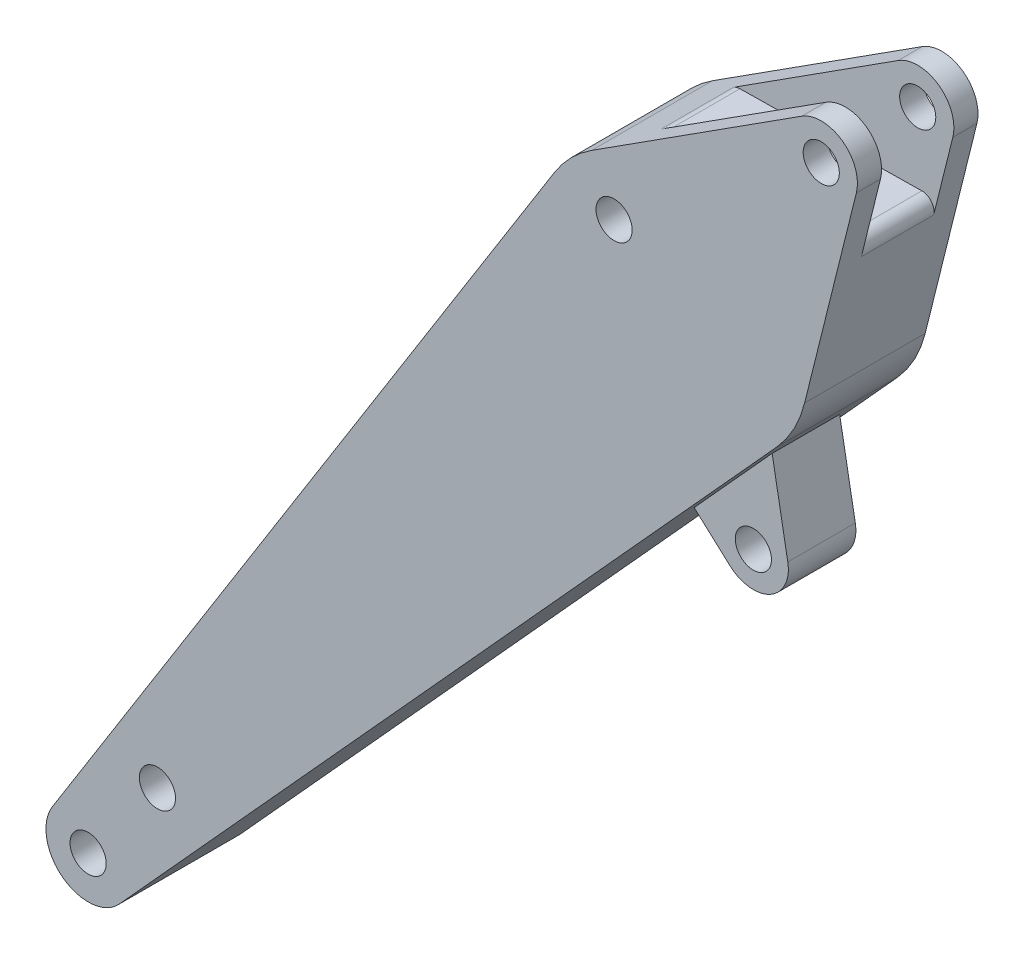
ISO-10303-21;
HEADER;
FILE_DESCRIPTION(('STEP AP214'),'2;1');
FILE_NAME('part.step','',(''),(''),'','','');
FILE_SCHEMA(('AUTOMOTIVE_DESIGN { 1 0 10303 214 1 1 1 1 }'));
ENDSEC;
DATA;
#1=APPLICATION_CONTEXT('core data for automotive mechanical design processes');
#2=APPLICATION_PROTOCOL_DEFINITION('international standard','automotive_design',2000,#1);
#3=PRODUCT_CONTEXT('',#1,'mechanical');
#4=PRODUCT('Part','Part','',(#3));
#5=PRODUCT_RELATED_PRODUCT_CATEGORY('part','',(#4));
#6=PRODUCT_DEFINITION_FORMATION('','',#4);
#7=PRODUCT_DEFINITION_CONTEXT('part definition',#1,'design');
#8=PRODUCT_DEFINITION('design','',#6,#7);
#9=PRODUCT_DEFINITION_SHAPE('','',#8);
#10=(LENGTH_UNIT() NAMED_UNIT(*) SI_UNIT(.MILLI.,.METRE.));
#11=(NAMED_UNIT(*) PLANE_ANGLE_UNIT() SI_UNIT($,.RADIAN.));
#12=(NAMED_UNIT(*) SI_UNIT($,.STERADIAN.) SOLID_ANGLE_UNIT());
#13=UNCERTAINTY_MEASURE_WITH_UNIT(LENGTH_MEASURE(1.E-05),#10,'distance_accuracy_value','');
#14=(GEOMETRIC_REPRESENTATION_CONTEXT(3) GLOBAL_UNCERTAINTY_ASSIGNED_CONTEXT((#13)) GLOBAL_UNIT_ASSIGNED_CONTEXT((#10,
#11,#12)) REPRESENTATION_CONTEXT('',''));
#15=CARTESIAN_POINT('',(0.,0.,0.));
#16=DIRECTION('',(0.,0.,1.));
#17=DIRECTION('',(1.,0.,0.));
#18=AXIS2_PLACEMENT_3D('',#15,#16,#17);
#19=CARTESIAN_POINT('',(268.272359212671,105.010587180975,-7.5));
#20=DIRECTION('',(0.740552858374982,-0.671998113057354,0.));
#21=DIRECTION('',(0.671998113057354,0.740552858374982,0.));
#22=AXIS2_PLACEMENT_3D('',#19,#20,#21);
#23=PLANE('',#22);
#24=DIRECTION('',(0.671998113057354,0.740552858374982,0.));
#25=VECTOR('',#24,1.);
#26=CARTESIAN_POINT('',(268.272359212671,105.010587180975,-7.5));
#27=LINE('',#26,#25);
#28=CARTESIAN_POINT('',(183.939116284921,12.0739808234994,-7.5));
#29=VERTEX_POINT('',#28);
#30=CARTESIAN_POINT('',(265.736612477699,102.216153005922,-7.5));
#31=VERTEX_POINT('',#30);
#32=EDGE_CURVE('E285',#29,#31,#27,.T.);
#33=ORIENTED_EDGE('',*,*,#32,.T.);
#34=DIRECTION('',(0.,0.,1.));
#35=VECTOR('',#34,1.);
#36=CARTESIAN_POINT('',(265.736612477699,102.216153005922,-7.5));
#37=LINE('',#36,#35);
#38=CARTESIAN_POINT('',(265.736612477699,102.216153005922,7.5));
#39=VERTEX_POINT('',#38);
#40=EDGE_CURVE('E299',#31,#39,#37,.T.);
#41=ORIENTED_EDGE('',*,*,#40,.T.);
#42=DIRECTION('',(0.671998113057354,0.740552858374982,0.));
#43=VECTOR('',#42,1.);
#44=CARTESIAN_POINT('',(268.272359212671,105.010587180975,7.5));
#45=LINE('',#44,#43);
#46=CARTESIAN_POINT('',(183.939116284921,12.0739808234994,7.5));
#47=VERTEX_POINT('',#46);
#48=EDGE_CURVE('E251',#47,#39,#45,.T.);
#49=ORIENTED_EDGE('',*,*,#48,.F.);
#50=DIRECTION('',(0.,0.,1.));
#51=VECTOR('',#50,1.);
#52=CARTESIAN_POINT('',(183.939116284921,12.0739808234994,-7.5));
#53=LINE('',#52,#51);
#54=EDGE_CURVE('E294',#29,#47,#53,.T.);
#55=ORIENTED_EDGE('',*,*,#54,.F.);
#56=EDGE_LOOP('',(#33,#41,#49,#55));
#57=FACE_BOUND('',#56,.T.);
#58=DIRECTION('',(0.,0.,1.));
#59=VECTOR('',#58,1.);
#60=CARTESIAN_POINT('',(261.843936235976,97.9263604283488,-4.2));
#61=LINE('',#60,#59);
#62=CARTESIAN_POINT('',(261.843936235976,97.9263604283488,-4.2));
#63=VERTEX_POINT('',#62);
#64=CARTESIAN_POINT('',(261.843936235976,97.9263604283488,4.2));
#65=VERTEX_POINT('',#64);
#66=EDGE_CURVE('E208',#63,#65,#61,.T.);
#67=ORIENTED_EDGE('',*,*,#66,.F.);
#68=DIRECTION('',(-0.671998113057354,-0.740552858374982,0.));
#69=VECTOR('',#68,1.);
#70=CARTESIAN_POINT('',(252.141372419818,87.2339771790396,-4.2));
#71=LINE('',#70,#69);
#72=CARTESIAN_POINT('',(252.141372419818,87.2339771790396,-4.2));
#73=VERTEX_POINT('',#72);
#74=EDGE_CURVE('E175',#63,#73,#71,.T.);
#75=ORIENTED_EDGE('',*,*,#74,.T.);
#76=DIRECTION('',(0.,0.,1.));
#77=VECTOR('',#76,1.);
#78=CARTESIAN_POINT('',(252.141372419818,87.2339771790396,-4.2));
#79=LINE('',#78,#77);
#80=CARTESIAN_POINT('',(252.141372419818,87.2339771790396,4.2));
#81=VERTEX_POINT('',#80);
#82=EDGE_CURVE('E168',#73,#81,#79,.T.);
#83=ORIENTED_EDGE('',*,*,#82,.T.);
#84=DIRECTION('',(-0.671998113057354,-0.740552858374982,0.));
#85=VECTOR('',#84,1.);
#86=CARTESIAN_POINT('',(252.141372419818,87.2339771790396,4.2));
#87=LINE('',#86,#85);
#88=EDGE_CURVE('E169',#65,#81,#87,.T.);
#89=ORIENTED_EDGE('',*,*,#88,.F.);
#90=EDGE_LOOP('',(#67,#75,#83,#89));
#91=FACE_BOUND('',#90,.T.);
#92=ADVANCED_FACE('F45',(#57,#91),#23,.T.);
#93=CARTESIAN_POINT('',(271.251213778452,135.60197091705,-7.5));
#94=DIRECTION('',(0.,0.,1.));
#95=DIRECTION('',(1.,0.,0.));
#96=AXIS2_PLACEMENT_3D('',#93,#94,#95);
#97=CYLINDRICAL_SURFACE('',#96,4.49999999999998);
#98=DIRECTION('',(0.,0.,1.));
#99=VECTOR('',#98,1.);
#100=CARTESIAN_POINT('',(268.822977766155,139.390594660389,-7.5));
#101=LINE('',#100,#99);
#102=CARTESIAN_POINT('',(268.822977766155,139.390594660389,-7.5));
#103=VERTEX_POINT('',#102);
#104=CARTESIAN_POINT('',(268.822977766155,139.390594660388,-4.5));
#105=VERTEX_POINT('',#104);
#106=EDGE_CURVE('E297',#103,#105,#101,.T.);
#107=ORIENTED_EDGE('',*,*,#106,.T.);
#108=CARTESIAN_POINT('',(271.251213778452,135.60197091705,-4.5));
#109=DIRECTION('',(0.,0.,1.));
#110=DIRECTION('',(1.,0.,0.));
#111=AXIS2_PLACEMENT_3D('',#108,#109,#110);
#112=CIRCLE('',#111,4.49999999999998);
#113=CARTESIAN_POINT('',(275.617915088876,134.51480962932,-4.5));
#114=VERTEX_POINT('',#113);
#115=EDGE_CURVE('E219',#114,#105,#112,.T.);
#116=ORIENTED_EDGE('',*,*,#115,.F.);
#117=DIRECTION('',(0.,0.,1.));
#118=VECTOR('',#117,1.);
#119=CARTESIAN_POINT('',(275.617915088876,134.51480962932,-7.5));
#120=LINE('',#119,#118);
#121=CARTESIAN_POINT('',(275.617915088876,134.51480962932,-7.5));
#122=VERTEX_POINT('',#121);
#123=EDGE_CURVE('E302',#122,#114,#120,.T.);
#124=ORIENTED_EDGE('',*,*,#123,.F.);
#125=CARTESIAN_POINT('',(271.251213778452,135.60197091705,-7.5));
#126=DIRECTION('',(0.,0.,1.));
#127=DIRECTION('',(-1.,0.,0.));
#128=AXIS2_PLACEMENT_3D('',#125,#126,#127);
#129=CIRCLE('',#128,4.49999999999998);
#130=EDGE_CURVE('E286',#122,#103,#129,.T.);
#131=ORIENTED_EDGE('',*,*,#130,.T.);
#132=EDGE_LOOP('',(#107,#116,#124,#131));
#133=FACE_BOUND('',#132,.T.);
#134=ADVANCED_FACE('F359',(#133),#97,.T.);
#135=CARTESIAN_POINT('',(271.251213778452,135.60197091705,-7.5));
#136=DIRECTION('',(0.,0.,1.));
#137=DIRECTION('',(1.,0.,0.));
#138=AXIS2_PLACEMENT_3D('',#135,#136,#137);
#139=CYLINDRICAL_SURFACE('',#138,2.25000000000004);
#140=CARTESIAN_POINT('',(271.251213778452,135.60197091705,-7.5));
#141=DIRECTION('',(0.,0.,1.));
#142=DIRECTION('',(1.,0.,0.));
#143=AXIS2_PLACEMENT_3D('',#140,#141,#142);
#144=CIRCLE('',#143,2.25000000000004);
#145=CARTESIAN_POINT('',(273.501213778452,135.60197091705,-7.5));
#146=VERTEX_POINT('',#145);
#147=EDGE_CURVE('E267',#146,#146,#144,.T.);
#148=ORIENTED_EDGE('',*,*,#147,.F.);
#149=EDGE_LOOP('',(#148));
#150=FACE_BOUND('',#149,.T.);
#151=CARTESIAN_POINT('',(271.251213778452,135.60197091705,-4.5));
#152=DIRECTION('',(0.,0.,1.));
#153=DIRECTION('',(1.,0.,0.));
#154=AXIS2_PLACEMENT_3D('',#151,#152,#153);
#155=CIRCLE('',#154,2.25000000000004);
#156=CARTESIAN_POINT('',(273.501213778452,135.60197091705,-4.5));
#157=VERTEX_POINT('',#156);
#158=EDGE_CURVE('E211',#157,#157,#155,.T.);
#159=ORIENTED_EDGE('',*,*,#158,.T.);
#160=EDGE_LOOP('',(#159));
#161=FACE_BOUND('',#160,.T.);
#162=ADVANCED_FACE('F408',(#150,#161),#139,.F.);
#163=CARTESIAN_POINT('',(180.051213778452,15.6019709170505,-7.5));
#164=DIRECTION('',(0.,0.,1.));
#165=DIRECTION('',(1.,0.,0.));
#166=AXIS2_PLACEMENT_3D('',#163,#164,#165);
#167=CYLINDRICAL_SURFACE('',#166,5.25000000000002);
#168=ORIENTED_EDGE('',*,*,#54,.T.);
#169=CARTESIAN_POINT('',(180.051213778452,15.6019709170505,7.5));
#170=DIRECTION('',(0.,0.,1.));
#171=DIRECTION('',(1.,0.,0.));
#172=AXIS2_PLACEMENT_3D('',#169,#170,#171);
#173=CIRCLE('',#172,5.25000000000002);
#174=CARTESIAN_POINT('',(175.603869390468,18.3918863090769,7.5));
#175=VERTEX_POINT('',#174);
#176=EDGE_CURVE('E252',#175,#47,#173,.T.);
#177=ORIENTED_EDGE('',*,*,#176,.F.);
#178=DIRECTION('',(0.,0.,1.));
#179=VECTOR('',#178,1.);
#180=CARTESIAN_POINT('',(175.603869390468,18.3918863090769,-7.5));
#181=LINE('',#180,#179);
#182=CARTESIAN_POINT('',(175.603869390468,18.3918863090769,-7.5));
#183=VERTEX_POINT('',#182);
#184=EDGE_CURVE('E298',#183,#175,#181,.T.);
#185=ORIENTED_EDGE('',*,*,#184,.F.);
#186=CARTESIAN_POINT('',(180.051213778452,15.6019709170505,-7.5));
#187=DIRECTION('',(0.,0.,1.));
#188=DIRECTION('',(1.,0.,0.));
#189=AXIS2_PLACEMENT_3D('',#186,#187,#188);
#190=CIRCLE('',#189,5.25000000000002);
#191=EDGE_CURVE('E278',#183,#29,#190,.T.);
#192=ORIENTED_EDGE('',*,*,#191,.T.);
#193=EDGE_LOOP('',(#168,#177,#185,#192));
#194=FACE_BOUND('',#193,.T.);
#195=ADVANCED_FACE('F384',(#194),#167,.T.);
#196=CARTESIAN_POINT('',(239.866500086119,120.831569891679,-7.5));
#197=DIRECTION('',(-0.847113216758896,0.531412455624063,0.));
#198=DIRECTION('',(-0.531412455624063,-0.847113216758896,0.));
#199=AXIS2_PLACEMENT_3D('',#196,#197,#198);
#200=PLANE('',#199);
#201=DIRECTION('',(-0.531412455624063,-0.847113216758896,0.));
#202=VECTOR('',#201,1.);
#203=CARTESIAN_POINT('',(239.866500086119,120.831569891679,7.5));
#204=LINE('',#203,#202);
#205=CARTESIAN_POINT('',(238.081653342399,117.98638391515,7.5));
#206=VERTEX_POINT('',#205);
#207=EDGE_CURVE('E264',#206,#175,#204,.T.);
#208=ORIENTED_EDGE('',*,*,#207,.F.);
#209=DIRECTION('',(0.,0.,1.));
#210=VECTOR('',#209,1.);
#211=CARTESIAN_POINT('',(238.081653342399,117.98638391515,-7.5));
#212=LINE('',#211,#210);
#213=CARTESIAN_POINT('',(238.081653342399,117.98638391515,-7.5));
#214=VERTEX_POINT('',#213);
#215=EDGE_CURVE('E323',#206,#214,#212,.F.);
#216=ORIENTED_EDGE('',*,*,#215,.T.);
#217=DIRECTION('',(-0.531412455624063,-0.847113216758896,0.));
#218=VECTOR('',#217,1.);
#219=CARTESIAN_POINT('',(239.866500086119,120.831569891679,-7.5));
#220=LINE('',#219,#218);
#221=EDGE_CURVE('E291',#214,#183,#220,.T.);
#222=ORIENTED_EDGE('',*,*,#221,.T.);
#223=ORIENTED_EDGE('',*,*,#184,.T.);
#224=EDGE_LOOP('',(#208,#216,#222,#223));
#225=FACE_BOUND('',#224,.T.);
#226=ADVANCED_FACE('F409',(#225),#200,.T.);
#227=CARTESIAN_POINT('',(268.822977766155,139.390594660389,-7.5));
#228=DIRECTION('',(-0.539608002732634,0.841916387408452,0.));
#229=DIRECTION('',(-0.841916387408452,-0.539608002732634,0.));
#230=AXIS2_PLACEMENT_3D('',#227,#228,#229);
#231=PLANE('',#230);
#232=DIRECTION('',(0.,0.,-1.));
#233=VECTOR('',#232,1.);
#234=CARTESIAN_POINT('',(248.346136663052,126.266408583038,-7.5));
#235=LINE('',#234,#233);
#236=CARTESIAN_POINT('',(248.346136663051,126.266408583038,4.5));
#237=VERTEX_POINT('',#236);
#238=CARTESIAN_POINT('',(248.346136663052,126.266408583038,-4.5));
#239=VERTEX_POINT('',#238);
#240=EDGE_CURVE('E333',#237,#239,#235,.T.);
#241=ORIENTED_EDGE('',*,*,#240,.T.);
#242=DIRECTION('',(-0.841916387408452,-0.539608002732634,0.));
#243=VECTOR('',#242,1.);
#244=CARTESIAN_POINT('',(-84.4778335396928,-87.0498785312536,-4.5));
#245=LINE('',#244,#243);
#246=EDGE_CURVE('E60',#105,#239,#245,.T.);
#247=ORIENTED_EDGE('',*,*,#246,.F.);
#248=ORIENTED_EDGE('',*,*,#106,.F.);
#249=DIRECTION('',(-0.841916387408452,-0.539608002732634,0.));
#250=VECTOR('',#249,1.);
#251=CARTESIAN_POINT('',(268.822977766155,139.390594660389,-7.5));
#252=LINE('',#251,#250);
#253=CARTESIAN_POINT('',(242.694231552793,122.643942891916,-7.5));
#254=VERTEX_POINT('',#253);
#255=EDGE_CURVE('E287',#103,#254,#252,.T.);
#256=ORIENTED_EDGE('',*,*,#255,.T.);
#257=DIRECTION('',(0.,0.,1.));
#258=VECTOR('',#257,1.);
#259=CARTESIAN_POINT('',(242.694231552793,122.643942891916,-7.5));
#260=LINE('',#259,#258);
#261=CARTESIAN_POINT('',(242.694231552793,122.643942891916,7.5));
#262=VERTEX_POINT('',#261);
#263=EDGE_CURVE('E324',#254,#262,#260,.T.);
#264=ORIENTED_EDGE('',*,*,#263,.T.);
#265=DIRECTION('',(-0.841916387408452,-0.539608002732634,0.));
#266=VECTOR('',#265,1.);
#267=CARTESIAN_POINT('',(268.822977766155,139.390594660389,7.5));
#268=LINE('',#267,#266);
#269=CARTESIAN_POINT('',(268.822977766155,139.390594660389,7.5));
#270=VERTEX_POINT('',#269);
#271=EDGE_CURVE('E265',#270,#262,#268,.T.);
#272=ORIENTED_EDGE('',*,*,#271,.F.);
#273=CARTESIAN_POINT('',(268.822977766155,139.390594660388,4.5));
#274=VERTEX_POINT('',#273);
#275=EDGE_CURVE('E303',#274,#270,#101,.T.);
#276=ORIENTED_EDGE('',*,*,#275,.F.);
#277=DIRECTION('',(-0.841916387408452,-0.539608002732634,0.));
#278=VECTOR('',#277,1.);
#279=CARTESIAN_POINT('',(-84.4778335396928,-87.0498785312536,4.5));
#280=LINE('',#279,#278);
#281=EDGE_CURVE('E62',#274,#237,#280,.T.);
#282=ORIENTED_EDGE('',*,*,#281,.T.);
#283=EDGE_LOOP('',(#241,#247,#248,#256,#264,#272,#276,#282));
#284=FACE_BOUND('',#283,.T.);
#285=ADVANCED_FACE('F393',(#284),#231,.T.);
#286=CARTESIAN_POINT('',(271.251213778452,135.60197091705,4.5));
#287=DIRECTION('',(0.,0.,1.));
#288=DIRECTION('',(1.,0.,0.));
#289=AXIS2_PLACEMENT_3D('',#286,#287,#288);
#290=CIRCLE('',#289,4.49999999999998);
#291=CARTESIAN_POINT('',(275.617915088876,134.51480962932,4.5));
#292=VERTEX_POINT('',#291);
#293=EDGE_CURVE('E235',#292,#274,#290,.T.);
#294=ORIENTED_EDGE('',*,*,#293,.T.);
#295=ORIENTED_EDGE('',*,*,#275,.T.);
#296=CARTESIAN_POINT('',(271.251213778452,135.60197091705,7.5));
#297=DIRECTION('',(0.,0.,1.));
#298=DIRECTION('',(-1.,0.,0.));
#299=AXIS2_PLACEMENT_3D('',#296,#297,#298);
#300=CIRCLE('',#299,4.49999999999998);
#301=CARTESIAN_POINT('',(275.617915088876,134.51480962932,7.5));
#302=VERTEX_POINT('',#301);
#303=EDGE_CURVE('E258',#302,#270,#300,.T.);
#304=ORIENTED_EDGE('',*,*,#303,.F.);
#305=EDGE_CURVE('E310',#292,#302,#120,.T.);
#306=ORIENTED_EDGE('',*,*,#305,.F.);
#307=EDGE_LOOP('',(#294,#295,#304,#306));
#308=FACE_BOUND('',#307,.T.);
#309=ADVANCED_FACE('F400',(#308),#97,.T.);
#310=CARTESIAN_POINT('',(268.272359212671,105.010587180975,-7.5));
#311=DIRECTION('',(0.97037806898317,-0.241591397273358,0.));
#312=DIRECTION('',(0.241591397273358,0.97037806898317,0.));
#313=AXIS2_PLACEMENT_3D('',#310,#311,#312);
#314=PLANE('',#313);
#315=DIRECTION('',(0.241591397273358,0.97037806898317,0.));
#316=VECTOR('',#315,1.);
#317=CARTESIAN_POINT('',(211.94806038838,-121.222072370656,-4.5));
#318=LINE('',#317,#316);
#319=CARTESIAN_POINT('',(273.237810212675,124.954860062356,-4.5));
#320=VERTEX_POINT('',#319);
#321=EDGE_CURVE('E218',#320,#114,#318,.T.);
#322=ORIENTED_EDGE('',*,*,#321,.F.);
#323=DIRECTION('',(0.,0.,-1.));
#324=VECTOR('',#323,1.);
#325=CARTESIAN_POINT('',(273.237810212675,124.954860062356,-7.5));
#326=LINE('',#325,#324);
#327=CARTESIAN_POINT('',(273.237810212675,124.954860062356,4.5));
#328=VERTEX_POINT('',#327);
#329=EDGE_CURVE('E334',#320,#328,#326,.F.);
#330=ORIENTED_EDGE('',*,*,#329,.T.);
#331=DIRECTION('',(0.241591397273358,0.97037806898317,0.));
#332=VECTOR('',#331,1.);
#333=CARTESIAN_POINT('',(211.94806038838,-121.222072370656,4.5));
#334=LINE('',#333,#332);
#335=EDGE_CURVE('E230',#328,#292,#334,.T.);
#336=ORIENTED_EDGE('',*,*,#335,.T.);
#337=ORIENTED_EDGE('',*,*,#305,.T.);
#338=DIRECTION('',(0.241591397273358,0.97037806898317,0.));
#339=VECTOR('',#338,1.);
#340=CARTESIAN_POINT('',(268.272359212671,105.010587180975,7.5));
#341=LINE('',#340,#339);
#342=CARTESIAN_POINT('',(269.183990636822,108.672253742682,7.5));
#343=VERTEX_POINT('',#342);
#344=EDGE_CURVE('E256',#343,#302,#341,.T.);
#345=ORIENTED_EDGE('',*,*,#344,.F.);
#346=DIRECTION('',(0.,0.,1.));
#347=VECTOR('',#346,1.);
#348=CARTESIAN_POINT('',(269.183990636822,108.672253742682,-7.5));
#349=LINE('',#348,#347);
#350=CARTESIAN_POINT('',(269.183990636822,108.672253742682,-7.5));
#351=VERTEX_POINT('',#350);
#352=EDGE_CURVE('E314',#343,#351,#349,.F.);
#353=ORIENTED_EDGE('',*,*,#352,.T.);
#354=DIRECTION('',(0.241591397273358,0.97037806898317,0.));
#355=VECTOR('',#354,1.);
#356=CARTESIAN_POINT('',(268.272359212671,105.010587180975,-7.5));
#357=LINE('',#356,#355);
#358=EDGE_CURVE('E284',#351,#122,#357,.T.);
#359=ORIENTED_EDGE('',*,*,#358,.T.);
#360=ORIENTED_EDGE('',*,*,#123,.T.);
#361=EDGE_LOOP('',(#322,#330,#336,#337,#345,#353,#359,#360));
#362=FACE_BOUND('',#361,.T.);
#363=ADVANCED_FACE('F365',(#362),#314,.T.);
#364=CARTESIAN_POINT('',(180.051213778452,15.6019709170505,-7.5));
#365=DIRECTION('',(0.,0.,1.));
#366=DIRECTION('',(1.,0.,0.));
#367=AXIS2_PLACEMENT_3D('',#364,#365,#366);
#368=PLANE('',#367);
#369=CARTESIAN_POINT('',(245.479443554687,116.565732855567,-7.5));
#370=DIRECTION('',(0.,0.,1.));
#371=DIRECTION('',(1.,0.,0.));
#372=AXIS2_PLACEMENT_3D('',#369,#370,#371);
#373=CIRCLE('',#372,2.24999999999998);
#374=CARTESIAN_POINT('',(247.729443554687,116.565732855567,-7.5));
#375=VERTEX_POINT('',#374);
#376=EDGE_CURVE('E266',#375,#375,#373,.T.);
#377=ORIENTED_EDGE('',*,*,#376,.T.);
#378=EDGE_LOOP('',(#377));
#379=FACE_BOUND('',#378,.T.);
#380=ORIENTED_EDGE('',*,*,#147,.T.);
#381=EDGE_LOOP('',(#380));
#382=FACE_BOUND('',#381,.T.);
#383=CARTESIAN_POINT('',(188.673650340805,26.9472821833047,-7.5));
#384=DIRECTION('',(0.,0.,1.));
#385=DIRECTION('',(1.,0.,0.));
#386=AXIS2_PLACEMENT_3D('',#383,#384,#385);
#387=CIRCLE('',#386,2.25);
#388=CARTESIAN_POINT('',(190.923650340805,26.9472821833047,-7.5));
#389=VERTEX_POINT('',#388);
#390=EDGE_CURVE('E271',#389,#389,#387,.T.);
#391=ORIENTED_EDGE('',*,*,#390,.T.);
#392=EDGE_LOOP('',(#391));
#393=FACE_BOUND('',#392,.T.);
#394=CARTESIAN_POINT('',(180.051213778452,15.6019709170505,-7.5));
#395=DIRECTION('',(0.,0.,1.));
#396=DIRECTION('',(1.,0.,0.));
#397=AXIS2_PLACEMENT_3D('',#394,#395,#396);
#398=CIRCLE('',#397,2.25);
#399=CARTESIAN_POINT('',(182.301213778452,15.6019709170505,-7.5));
#400=VERTEX_POINT('',#399);
#401=EDGE_CURVE('E279',#400,#400,#398,.T.);
#402=ORIENTED_EDGE('',*,*,#401,.T.);
#403=EDGE_LOOP('',(#402));
#404=FACE_BOUND('',#403,.T.);
#405=ORIENTED_EDGE('',*,*,#358,.F.);
#406=CARTESIAN_POINT('',(254.628319602075,112.296124701782,-7.5));
#407=DIRECTION('',(0.,0.,1.));
#408=DIRECTION('',(1.,0.,0.));
#409=AXIS2_PLACEMENT_3D('',#406,#407,#408);
#410=CIRCLE('',#409,15.);
#411=EDGE_CURVE('E316',#351,#31,#410,.F.);
#412=ORIENTED_EDGE('',*,*,#411,.T.);
#413=ORIENTED_EDGE('',*,*,#32,.F.);
#414=ORIENTED_EDGE('',*,*,#191,.F.);
#415=ORIENTED_EDGE('',*,*,#221,.F.);
#416=CARTESIAN_POINT('',(250.788351593783,110.015197080789,-7.5));
#417=DIRECTION('',(0.,0.,1.));
#418=DIRECTION('',(1.,0.,0.));
#419=AXIS2_PLACEMENT_3D('',#416,#417,#418);
#420=CIRCLE('',#419,15.);
#421=EDGE_CURVE('E320',#214,#254,#420,.F.);
#422=ORIENTED_EDGE('',*,*,#421,.T.);
#423=ORIENTED_EDGE('',*,*,#255,.F.);
#424=ORIENTED_EDGE('',*,*,#130,.F.);
#425=EDGE_LOOP('',(#405,#412,#413,#414,#415,#422,#423,#424));
#426=FACE_BOUND('',#425,.T.);
#427=ADVANCED_FACE('F368',(#379,#382,#393,#404,#426),#368,.F.);
#428=CARTESIAN_POINT('',(180.051213778452,15.6019709170505,-7.5));
#429=DIRECTION('',(0.,0.,1.));
#430=DIRECTION('',(1.,0.,0.));
#431=AXIS2_PLACEMENT_3D('',#428,#429,#430);
#432=CYLINDRICAL_SURFACE('',#431,2.25);
#433=ORIENTED_EDGE('',*,*,#401,.F.);
#434=EDGE_LOOP('',(#433));
#435=FACE_BOUND('',#434,.T.);
#436=CARTESIAN_POINT('',(180.051213778452,15.6019709170505,7.5));
#437=DIRECTION('',(0.,0.,1.));
#438=DIRECTION('',(1.,0.,0.));
#439=AXIS2_PLACEMENT_3D('',#436,#437,#438);
#440=CIRCLE('',#439,2.25);
#441=CARTESIAN_POINT('',(182.301213778452,15.6019709170505,7.5));
#442=VERTEX_POINT('',#441);
#443=EDGE_CURVE('E247',#442,#442,#440,.T.);
#444=ORIENTED_EDGE('',*,*,#443,.T.);
#445=EDGE_LOOP('',(#444));
#446=FACE_BOUND('',#445,.T.);
#447=ADVANCED_FACE('F543',(#435,#446),#432,.F.);
#448=CARTESIAN_POINT('',(188.673650340805,26.9472821833047,-7.5));
#449=DIRECTION('',(0.,0.,1.));
#450=DIRECTION('',(1.,0.,0.));
#451=AXIS2_PLACEMENT_3D('',#448,#449,#450);
#452=CYLINDRICAL_SURFACE('',#451,2.25);
#453=ORIENTED_EDGE('',*,*,#390,.F.);
#454=EDGE_LOOP('',(#453));
#455=FACE_BOUND('',#454,.T.);
#456=CARTESIAN_POINT('',(188.673650340805,26.9472821833047,7.5));
#457=DIRECTION('',(0.,0.,1.));
#458=DIRECTION('',(1.,0.,0.));
#459=AXIS2_PLACEMENT_3D('',#456,#457,#458);
#460=CIRCLE('',#459,2.25);
#461=CARTESIAN_POINT('',(190.923650340805,26.9472821833047,7.5));
#462=VERTEX_POINT('',#461);
#463=EDGE_CURVE('E244',#462,#462,#460,.T.);
#464=ORIENTED_EDGE('',*,*,#463,.T.);
#465=EDGE_LOOP('',(#464));
#466=FACE_BOUND('',#465,.T.);
#467=ADVANCED_FACE('F539',(#455,#466),#452,.F.);
#468=CARTESIAN_POINT('',(271.251213778452,135.60197091705,4.5));
#469=DIRECTION('',(0.,0.,1.));
#470=DIRECTION('',(1.,0.,0.));
#471=AXIS2_PLACEMENT_3D('',#468,#469,#470);
#472=CIRCLE('',#471,2.25000000000004);
#473=CARTESIAN_POINT('',(273.501213778452,135.60197091705,4.5));
#474=VERTEX_POINT('',#473);
#475=EDGE_CURVE('E228',#474,#474,#472,.T.);
#476=ORIENTED_EDGE('',*,*,#475,.F.);
#477=EDGE_LOOP('',(#476));
#478=FACE_BOUND('',#477,.T.);
#479=CARTESIAN_POINT('',(271.251213778452,135.60197091705,7.5));
#480=DIRECTION('',(0.,0.,1.));
#481=DIRECTION('',(1.,0.,0.));
#482=AXIS2_PLACEMENT_3D('',#479,#480,#481);
#483=CIRCLE('',#482,2.25000000000004);
#484=CARTESIAN_POINT('',(273.501213778452,135.60197091705,7.5));
#485=VERTEX_POINT('',#484);
#486=EDGE_CURVE('E245',#485,#485,#483,.T.);
#487=ORIENTED_EDGE('',*,*,#486,.T.);
#488=EDGE_LOOP('',(#487));
#489=FACE_BOUND('',#488,.T.);
#490=ADVANCED_FACE('F519',(#478,#489),#139,.F.);
#491=CARTESIAN_POINT('',(245.479443554687,116.565732855567,-7.5));
#492=DIRECTION('',(0.,0.,1.));
#493=DIRECTION('',(1.,0.,0.));
#494=AXIS2_PLACEMENT_3D('',#491,#492,#493);
#495=CYLINDRICAL_SURFACE('',#494,2.24999999999998);
#496=ORIENTED_EDGE('',*,*,#376,.F.);
#497=EDGE_LOOP('',(#496));
#498=FACE_BOUND('',#497,.T.);
#499=CARTESIAN_POINT('',(245.479443554687,116.565732855567,7.5));
#500=DIRECTION('',(0.,0.,1.));
#501=DIRECTION('',(1.,0.,0.));
#502=AXIS2_PLACEMENT_3D('',#499,#500,#501);
#503=CIRCLE('',#502,2.24999999999998);
#504=CARTESIAN_POINT('',(247.729443554687,116.565732855567,7.5));
#505=VERTEX_POINT('',#504);
#506=EDGE_CURVE('E237',#505,#505,#503,.T.);
#507=ORIENTED_EDGE('',*,*,#506,.T.);
#508=EDGE_LOOP('',(#507));
#509=FACE_BOUND('',#508,.T.);
#510=ADVANCED_FACE('F521',(#498,#509),#495,.F.);
#511=CARTESIAN_POINT('',(180.051213778452,15.6019709170505,7.5));
#512=DIRECTION('',(0.,0.,1.));
#513=DIRECTION('',(1.,0.,0.));
#514=AXIS2_PLACEMENT_3D('',#511,#512,#513);
#515=PLANE('',#514);
#516=ORIENTED_EDGE('',*,*,#486,.F.);
#517=EDGE_LOOP('',(#516));
#518=FACE_BOUND('',#517,.T.);
#519=ORIENTED_EDGE('',*,*,#443,.F.);
#520=EDGE_LOOP('',(#519));
#521=FACE_BOUND('',#520,.T.);
#522=ORIENTED_EDGE('',*,*,#48,.T.);
#523=CARTESIAN_POINT('',(254.628319602075,112.296124701782,7.5));
#524=DIRECTION('',(0.,0.,1.));
#525=DIRECTION('',(1.,0.,0.));
#526=AXIS2_PLACEMENT_3D('',#523,#524,#525);
#527=CIRCLE('',#526,15.);
#528=EDGE_CURVE('E312',#39,#343,#527,.T.);
#529=ORIENTED_EDGE('',*,*,#528,.T.);
#530=ORIENTED_EDGE('',*,*,#344,.T.);
#531=ORIENTED_EDGE('',*,*,#303,.T.);
#532=ORIENTED_EDGE('',*,*,#271,.T.);
#533=CARTESIAN_POINT('',(250.788351593783,110.015197080789,7.5));
#534=DIRECTION('',(0.,0.,1.));
#535=DIRECTION('',(1.,0.,0.));
#536=AXIS2_PLACEMENT_3D('',#533,#534,#535);
#537=CIRCLE('',#536,15.);
#538=EDGE_CURVE('E311',#262,#206,#537,.T.);
#539=ORIENTED_EDGE('',*,*,#538,.T.);
#540=ORIENTED_EDGE('',*,*,#207,.T.);
#541=ORIENTED_EDGE('',*,*,#176,.T.);
#542=EDGE_LOOP('',(#522,#529,#530,#531,#532,#539,#540,#541));
#543=FACE_BOUND('',#542,.T.);
#544=ORIENTED_EDGE('',*,*,#463,.F.);
#545=EDGE_LOOP('',(#544));
#546=FACE_BOUND('',#545,.T.);
#547=ORIENTED_EDGE('',*,*,#506,.F.);
#548=EDGE_LOOP('',(#547));
#549=FACE_BOUND('',#548,.T.);
#550=ADVANCED_FACE('F380',(#518,#521,#543,#546,#549),#515,.T.);
#551=CARTESIAN_POINT('',(-116.935528022161,121.427921854307,4.5));
#552=DIRECTION('',(-0.0138634040781688,0.999903898395923,0.));
#553=DIRECTION('',(-0.999903898395924,-0.0138634040781688,0.));
#554=AXIS2_PLACEMENT_3D('',#551,#552,#553);
#555=PLANE('',#554);
#556=DIRECTION('',(0.999903898395924,0.0138634040781688,0.));
#557=VECTOR('',#556,1.);
#558=CARTESIAN_POINT('',(-116.935528022161,121.427921854307,4.5));
#559=LINE('',#558,#557);
#560=CARTESIAN_POINT('',(249.134753561033,126.503389849519,4.5));
#561=VERTEX_POINT('',#560);
#562=CARTESIAN_POINT('',(271.761448003083,126.81710300586,4.5));
#563=VERTEX_POINT('',#562);
#564=EDGE_CURVE('E236',#561,#563,#559,.T.);
#565=ORIENTED_EDGE('',*,*,#564,.T.);
#566=DIRECTION('',(0.,0.,-1.));
#567=VECTOR('',#566,1.);
#568=CARTESIAN_POINT('',(271.761448003083,126.81710300586,4.5));
#569=LINE('',#568,#567);
#570=CARTESIAN_POINT('',(271.761448003083,126.81710300586,-4.5));
#571=VERTEX_POINT('',#570);
#572=EDGE_CURVE('E328',#563,#571,#569,.T.);
#573=ORIENTED_EDGE('',*,*,#572,.T.);
#574=DIRECTION('',(0.999903898395924,0.0138634040781688,0.));
#575=VECTOR('',#574,1.);
#576=CARTESIAN_POINT('',(-116.935528022161,121.427921854307,-4.5));
#577=LINE('',#576,#575);
#578=CARTESIAN_POINT('',(249.134753561033,126.503389849519,-4.5));
#579=VERTEX_POINT('',#578);
#580=EDGE_CURVE('E225',#579,#571,#577,.T.);
#581=ORIENTED_EDGE('',*,*,#580,.F.);
#582=DIRECTION('',(0.,0.,-1.));
#583=VECTOR('',#582,1.);
#584=CARTESIAN_POINT('',(249.134753561033,126.503389849519,4.5));
#585=LINE('',#584,#583);
#586=EDGE_CURVE('E326',#579,#561,#585,.F.);
#587=ORIENTED_EDGE('',*,*,#586,.T.);
#588=EDGE_LOOP('',(#565,#573,#581,#587));
#589=FACE_BOUND('',#588,.T.);
#590=ADVANCED_FACE('F346',(#589),#555,.T.);
#591=CARTESIAN_POINT('',(-114.698786221548,-39.8980290829495,4.5));
#592=DIRECTION('',(0.,0.,1.));
#593=DIRECTION('',(1.,0.,0.));
#594=AXIS2_PLACEMENT_3D('',#591,#592,#593);
#595=PLANE('',#594);
#596=ORIENTED_EDGE('',*,*,#475,.T.);
#597=EDGE_LOOP('',(#596));
#598=FACE_BOUND('',#597,.T.);
#599=ORIENTED_EDGE('',*,*,#335,.F.);
#600=CARTESIAN_POINT('',(271.7822431092,125.317247158266,4.5));
#601=DIRECTION('',(0.,0.,1.));
#602=DIRECTION('',(1.,0.,0.));
#603=AXIS2_PLACEMENT_3D('',#600,#601,#602);
#604=CIRCLE('',#603,1.5);
#605=EDGE_CURVE('E339',#328,#563,#604,.T.);
#606=ORIENTED_EDGE('',*,*,#605,.T.);
#607=ORIENTED_EDGE('',*,*,#564,.F.);
#608=CARTESIAN_POINT('',(249.15554866715,125.003534001925,4.5));
#609=DIRECTION('',(0.,0.,1.));
#610=DIRECTION('',(1.,0.,0.));
#611=AXIS2_PLACEMENT_3D('',#608,#609,#610);
#612=CIRCLE('',#611,1.5);
#613=EDGE_CURVE('E12',#561,#237,#612,.T.);
#614=ORIENTED_EDGE('',*,*,#613,.T.);
#615=ORIENTED_EDGE('',*,*,#281,.F.);
#616=ORIENTED_EDGE('',*,*,#293,.F.);
#617=EDGE_LOOP('',(#599,#606,#607,#614,#615,#616));
#618=FACE_BOUND('',#617,.T.);
#619=ADVANCED_FACE('F354',(#598,#618),#595,.F.);
#620=CARTESIAN_POINT('',(-114.698786221548,-39.8980290829495,-4.5));
#621=DIRECTION('',(0.,0.,1.));
#622=DIRECTION('',(1.,0.,0.));
#623=AXIS2_PLACEMENT_3D('',#620,#621,#622);
#624=PLANE('',#623);
#625=ORIENTED_EDGE('',*,*,#158,.F.);
#626=EDGE_LOOP('',(#625));
#627=FACE_BOUND('',#626,.T.);
#628=ORIENTED_EDGE('',*,*,#321,.T.);
#629=ORIENTED_EDGE('',*,*,#115,.T.);
#630=ORIENTED_EDGE('',*,*,#246,.T.);
#631=CARTESIAN_POINT('',(249.15554866715,125.003534001925,-4.5));
#632=DIRECTION('',(0.,0.,1.));
#633=DIRECTION('',(1.,0.,0.));
#634=AXIS2_PLACEMENT_3D('',#631,#632,#633);
#635=CIRCLE('',#634,1.5);
#636=EDGE_CURVE('E49',#239,#579,#635,.F.);
#637=ORIENTED_EDGE('',*,*,#636,.T.);
#638=ORIENTED_EDGE('',*,*,#580,.T.);
#639=CARTESIAN_POINT('',(271.7822431092,125.317247158266,-4.5));
#640=DIRECTION('',(0.,0.,1.));
#641=DIRECTION('',(1.,0.,0.));
#642=AXIS2_PLACEMENT_3D('',#639,#640,#641);
#643=CIRCLE('',#642,1.5);
#644=EDGE_CURVE('E337',#571,#320,#643,.F.);
#645=ORIENTED_EDGE('',*,*,#644,.T.);
#646=EDGE_LOOP('',(#628,#629,#630,#637,#638,#645));
#647=FACE_BOUND('',#646,.T.);
#648=ADVANCED_FACE('F344',(#627,#647),#624,.T.);
#649=CARTESIAN_POINT('',(261.843936235976,97.9263604283488,-4.2));
#650=DIRECTION('',(0.983969653040116,0.178335980374446,0.));
#651=DIRECTION('',(-0.178335980374446,0.983969653040116,0.));
#652=AXIS2_PLACEMENT_3D('',#649,#650,#651);
#653=PLANE('',#652);
#654=ORIENTED_EDGE('',*,*,#66,.T.);
#655=DIRECTION('',(-0.178335980374446,0.983969653040115,0.));
#656=VECTOR('',#655,1.);
#657=CARTESIAN_POINT('',(261.843936235976,97.9263604283488,4.2));
#658=LINE('',#657,#656);
#659=CARTESIAN_POINT('',(263.788149352592,87.1991549492554,4.2));
#660=VERTEX_POINT('',#659);
#661=EDGE_CURVE('E194',#660,#65,#658,.T.);
#662=ORIENTED_EDGE('',*,*,#661,.F.);
#663=DIRECTION('',(0.,0.,1.));
#664=VECTOR('',#663,1.);
#665=CARTESIAN_POINT('',(263.788149352592,87.1991549492554,-4.2));
#666=LINE('',#665,#664);
#667=CARTESIAN_POINT('',(263.788149352592,87.1991549492554,-4.2));
#668=VERTEX_POINT('',#667);
#669=EDGE_CURVE('E215',#668,#660,#666,.T.);
#670=ORIENTED_EDGE('',*,*,#669,.F.);
#671=DIRECTION('',(-0.178335980374446,0.983969653040115,0.));
#672=VECTOR('',#671,1.);
#673=CARTESIAN_POINT('',(261.843936235976,97.9263604283488,-4.2));
#674=LINE('',#673,#672);
#675=EDGE_CURVE('E180',#668,#63,#674,.T.);
#676=ORIENTED_EDGE('',*,*,#675,.T.);
#677=EDGE_LOOP('',(#654,#662,#670,#676));
#678=FACE_BOUND('',#677,.T.);
#679=ADVANCED_FACE('F471',(#678),#653,.T.);
#680=CARTESIAN_POINT('',(259.507881361867,86.4233934346266,-4.2));
#681=DIRECTION('',(0.,0.,1.));
#682=DIRECTION('',(1.,0.,0.));
#683=AXIS2_PLACEMENT_3D('',#680,#681,#682);
#684=CYLINDRICAL_SURFACE('',#683,4.35000000000008);
#685=ORIENTED_EDGE('',*,*,#669,.T.);
#686=CARTESIAN_POINT('',(259.507881361867,86.4233934346266,4.2));
#687=DIRECTION('',(0.,0.,1.));
#688=DIRECTION('',(1.,0.,0.));
#689=AXIS2_PLACEMENT_3D('',#686,#687,#688);
#690=CIRCLE('',#689,4.35000000000008);
#691=CARTESIAN_POINT('',(256.584689570067,83.2019885006954,4.2));
#692=VERTEX_POINT('',#691);
#693=EDGE_CURVE('E184',#692,#660,#690,.T.);
#694=ORIENTED_EDGE('',*,*,#693,.F.);
#695=DIRECTION('',(0.,0.,1.));
#696=VECTOR('',#695,1.);
#697=CARTESIAN_POINT('',(256.584689570067,83.2019885006954,-4.2));
#698=LINE('',#697,#696);
#699=CARTESIAN_POINT('',(256.584689570067,83.2019885006954,-4.2));
#700=VERTEX_POINT('',#699);
#701=EDGE_CURVE('E176',#700,#692,#698,.T.);
#702=ORIENTED_EDGE('',*,*,#701,.F.);
#703=CARTESIAN_POINT('',(259.507881361867,86.4233934346266,-4.2));
#704=DIRECTION('',(0.,0.,1.));
#705=DIRECTION('',(1.,0.,0.));
#706=AXIS2_PLACEMENT_3D('',#703,#704,#705);
#707=CIRCLE('',#706,4.35000000000008);
#708=EDGE_CURVE('E202',#700,#668,#707,.T.);
#709=ORIENTED_EDGE('',*,*,#708,.T.);
#710=EDGE_LOOP('',(#685,#694,#702,#709));
#711=FACE_BOUND('',#710,.T.);
#712=ADVANCED_FACE('F462',(#711),#684,.T.);
#713=CARTESIAN_POINT('',(252.141372419818,87.2339771790396,-4.2));
#714=DIRECTION('',(-0.671998113057355,-0.740552858374981,0.));
#715=DIRECTION('',(0.740552858374981,-0.671998113057355,0.));
#716=AXIS2_PLACEMENT_3D('',#713,#714,#715);
#717=PLANE('',#716);
#718=ORIENTED_EDGE('',*,*,#701,.T.);
#719=DIRECTION('',(0.740552858374981,-0.671998113057355,0.));
#720=VECTOR('',#719,1.);
#721=CARTESIAN_POINT('',(252.141372419818,87.2339771790396,4.2));
#722=LINE('',#721,#720);
#723=EDGE_CURVE('E179',#81,#692,#722,.T.);
#724=ORIENTED_EDGE('',*,*,#723,.F.);
#725=ORIENTED_EDGE('',*,*,#82,.F.);
#726=DIRECTION('',(0.740552858374981,-0.671998113057355,0.));
#727=VECTOR('',#726,1.);
#728=CARTESIAN_POINT('',(252.141372419818,87.2339771790396,-4.2));
#729=LINE('',#728,#727);
#730=EDGE_CURVE('E205',#73,#700,#729,.T.);
#731=ORIENTED_EDGE('',*,*,#730,.T.);
#732=EDGE_LOOP('',(#718,#724,#725,#731));
#733=FACE_BOUND('',#732,.T.);
#734=ADVANCED_FACE('F181',(#733),#717,.T.);
#735=CARTESIAN_POINT('',(259.507881361867,86.4233934346266,-4.2));
#736=DIRECTION('',(0.,0.,1.));
#737=DIRECTION('',(1.,0.,0.));
#738=AXIS2_PLACEMENT_3D('',#735,#736,#737);
#739=PLANE('',#738);
#740=CARTESIAN_POINT('',(259.507881361867,86.4233934346266,-4.2));
#741=DIRECTION('',(0.,0.,1.));
#742=DIRECTION('',(1.,0.,0.));
#743=AXIS2_PLACEMENT_3D('',#740,#741,#742);
#744=CIRCLE('',#743,2.25000000000012);
#745=CARTESIAN_POINT('',(261.757881361867,86.4233934346266,-4.2));
#746=VERTEX_POINT('',#745);
#747=EDGE_CURVE('E197',#746,#746,#744,.T.);
#748=ORIENTED_EDGE('',*,*,#747,.T.);
#749=EDGE_LOOP('',(#748));
#750=FACE_BOUND('',#749,.T.);
#751=ORIENTED_EDGE('',*,*,#74,.F.);
#752=ORIENTED_EDGE('',*,*,#675,.F.);
#753=ORIENTED_EDGE('',*,*,#708,.F.);
#754=ORIENTED_EDGE('',*,*,#730,.F.);
#755=EDGE_LOOP('',(#751,#752,#753,#754));
#756=FACE_BOUND('',#755,.T.);
#757=ADVANCED_FACE('F448',(#750,#756),#739,.F.);
#758=CARTESIAN_POINT('',(259.507881361867,86.4233934346266,-4.2));
#759=DIRECTION('',(0.,0.,1.));
#760=DIRECTION('',(1.,0.,0.));
#761=AXIS2_PLACEMENT_3D('',#758,#759,#760);
#762=CYLINDRICAL_SURFACE('',#761,2.25000000000012);
#763=ORIENTED_EDGE('',*,*,#747,.F.);
#764=EDGE_LOOP('',(#763));
#765=FACE_BOUND('',#764,.T.);
#766=CARTESIAN_POINT('',(259.507881361867,86.4233934346266,4.2));
#767=DIRECTION('',(0.,0.,1.));
#768=DIRECTION('',(1.,0.,0.));
#769=AXIS2_PLACEMENT_3D('',#766,#767,#768);
#770=CIRCLE('',#769,2.25000000000012);
#771=CARTESIAN_POINT('',(261.757881361867,86.4233934346266,4.2));
#772=VERTEX_POINT('',#771);
#773=EDGE_CURVE('E191',#772,#772,#770,.T.);
#774=ORIENTED_EDGE('',*,*,#773,.T.);
#775=EDGE_LOOP('',(#774));
#776=FACE_BOUND('',#775,.T.);
#777=ADVANCED_FACE('F442',(#765,#776),#762,.F.);
#778=CARTESIAN_POINT('',(259.507881361867,86.4233934346266,4.2));
#779=DIRECTION('',(0.,0.,1.));
#780=DIRECTION('',(1.,0.,0.));
#781=AXIS2_PLACEMENT_3D('',#778,#779,#780);
#782=PLANE('',#781);
#783=ORIENTED_EDGE('',*,*,#88,.T.);
#784=ORIENTED_EDGE('',*,*,#723,.T.);
#785=ORIENTED_EDGE('',*,*,#693,.T.);
#786=ORIENTED_EDGE('',*,*,#661,.T.);
#787=EDGE_LOOP('',(#783,#784,#785,#786));
#788=FACE_BOUND('',#787,.T.);
#789=ORIENTED_EDGE('',*,*,#773,.F.);
#790=EDGE_LOOP('',(#789));
#791=FACE_BOUND('',#790,.T.);
#792=ADVANCED_FACE('F189',(#788,#791),#782,.T.);
#793=CARTESIAN_POINT('',(254.628319602075,112.296124701782,-7.5));
#794=DIRECTION('',(0.,0.,1.));
#795=DIRECTION('',(1.,0.,0.));
#796=AXIS2_PLACEMENT_3D('',#793,#794,#795);
#797=CYLINDRICAL_SURFACE('',#796,15.);
#798=ORIENTED_EDGE('',*,*,#411,.F.);
#799=ORIENTED_EDGE('',*,*,#352,.F.);
#800=ORIENTED_EDGE('',*,*,#528,.F.);
#801=ORIENTED_EDGE('',*,*,#40,.F.);
#802=EDGE_LOOP('',(#798,#799,#800,#801));
#803=FACE_BOUND('',#802,.T.);
#804=ADVANCED_FACE('F373',(#803),#797,.T.);
#805=CARTESIAN_POINT('',(250.788351593783,110.015197080789,-7.5));
#806=DIRECTION('',(0.,0.,1.));
#807=DIRECTION('',(1.,0.,0.));
#808=AXIS2_PLACEMENT_3D('',#805,#806,#807);
#809=CYLINDRICAL_SURFACE('',#808,15.);
#810=ORIENTED_EDGE('',*,*,#421,.F.);
#811=ORIENTED_EDGE('',*,*,#215,.F.);
#812=ORIENTED_EDGE('',*,*,#538,.F.);
#813=ORIENTED_EDGE('',*,*,#263,.F.);
#814=EDGE_LOOP('',(#810,#811,#812,#813));
#815=FACE_BOUND('',#814,.T.);
#816=ADVANCED_FACE('F391',(#815),#809,.T.);
#817=CARTESIAN_POINT('',(271.7822431092,125.317247158266,4.5));
#818=DIRECTION('',(0.,0.,-1.));
#819=DIRECTION('',(-1.,0.,0.));
#820=AXIS2_PLACEMENT_3D('',#817,#818,#819);
#821=CYLINDRICAL_SURFACE('',#820,1.5);
#822=ORIENTED_EDGE('',*,*,#605,.F.);
#823=ORIENTED_EDGE('',*,*,#329,.F.);
#824=ORIENTED_EDGE('',*,*,#644,.F.);
#825=ORIENTED_EDGE('',*,*,#572,.F.);
#826=EDGE_LOOP('',(#822,#823,#824,#825));
#827=FACE_BOUND('',#826,.T.);
#828=ADVANCED_FACE('F353',(#827),#821,.T.);
#829=CARTESIAN_POINT('',(249.15554866715,125.003534001925,-7.5));
#830=DIRECTION('',(0.,0.,-1.));
#831=DIRECTION('',(-1.,0.,0.));
#832=AXIS2_PLACEMENT_3D('',#829,#830,#831);
#833=CYLINDRICAL_SURFACE('',#832,1.5);
#834=ORIENTED_EDGE('',*,*,#613,.F.);
#835=ORIENTED_EDGE('',*,*,#586,.F.);
#836=ORIENTED_EDGE('',*,*,#636,.F.);
#837=ORIENTED_EDGE('',*,*,#240,.F.);
#838=EDGE_LOOP('',(#834,#835,#836,#837));
#839=FACE_BOUND('',#838,.T.);
#840=ADVANCED_FACE('F42',(#839),#833,.T.);
#841=CLOSED_SHELL('',(#92,#134,#162,#195,#226,#285,#309,#363,#427,#447,#467,#490,#510,#550,#590,
#619,#648,#679,#712,#734,#757,#777,#792,#804,#816,#828,#840));
#842=MANIFOLD_SOLID_BREP('B2',#841);
#843=ADVANCED_BREP_SHAPE_REPRESENTATION('',(#18,#842),#14);
#844=SHAPE_DEFINITION_REPRESENTATION(#9,#843);
ENDSEC;
END-ISO-10303-21;
